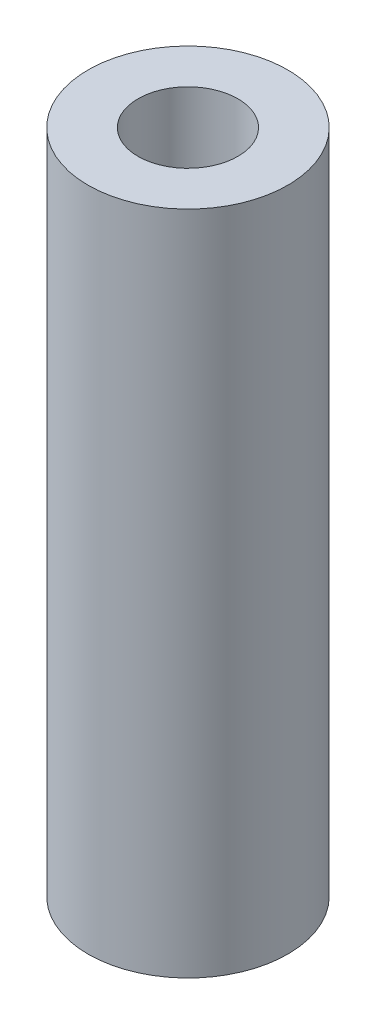
ISO-10303-21;
HEADER;
FILE_DESCRIPTION(('STEP AP214'),'2;1');
FILE_NAME('part.step','',(''),(''),'','','');
FILE_SCHEMA(('AUTOMOTIVE_DESIGN { 1 0 10303 214 1 1 1 1 }'));
ENDSEC;
DATA;
#1=APPLICATION_CONTEXT('core data for automotive mechanical design processes');
#2=APPLICATION_PROTOCOL_DEFINITION('international standard','automotive_design',2000,#1);
#3=PRODUCT_CONTEXT('',#1,'mechanical');
#4=PRODUCT('Part','Part','',(#3));
#5=PRODUCT_RELATED_PRODUCT_CATEGORY('part','',(#4));
#6=PRODUCT_DEFINITION_FORMATION('','',#4);
#7=PRODUCT_DEFINITION_CONTEXT('part definition',#1,'design');
#8=PRODUCT_DEFINITION('design','',#6,#7);
#9=PRODUCT_DEFINITION_SHAPE('','',#8);
#10=(LENGTH_UNIT() NAMED_UNIT(*) SI_UNIT(.MILLI.,.METRE.));
#11=(NAMED_UNIT(*) PLANE_ANGLE_UNIT() SI_UNIT($,.RADIAN.));
#12=(NAMED_UNIT(*) SI_UNIT($,.STERADIAN.) SOLID_ANGLE_UNIT());
#13=UNCERTAINTY_MEASURE_WITH_UNIT(LENGTH_MEASURE(1.E-05),#10,'distance_accuracy_value','');
#14=(GEOMETRIC_REPRESENTATION_CONTEXT(3) GLOBAL_UNCERTAINTY_ASSIGNED_CONTEXT((#13)) GLOBAL_UNIT_ASSIGNED_CONTEXT((#10,
#11,#12)) REPRESENTATION_CONTEXT('',''));
#15=CARTESIAN_POINT('',(0.,0.,0.));
#16=DIRECTION('',(0.,0.,1.));
#17=DIRECTION('',(1.,0.,0.));
#18=AXIS2_PLACEMENT_3D('',#15,#16,#17);
#19=CARTESIAN_POINT('',(0.,20.,0.));
#20=DIRECTION('',(0.,1.,0.));
#21=DIRECTION('',(0.,0.,1.));
#22=AXIS2_PLACEMENT_3D('',#19,#20,#21);
#23=PLANE('',#22);
#24=CARTESIAN_POINT('',(0.,20.,0.));
#25=DIRECTION('',(0.,1.,0.));
#26=DIRECTION('',(0.,0.,1.));
#27=AXIS2_PLACEMENT_3D('',#24,#25,#26);
#28=CIRCLE('',#27,3.);
#29=CARTESIAN_POINT('',(0.,20.,3.));
#30=VERTEX_POINT('',#29);
#31=EDGE_CURVE('E10',#30,#30,#28,.T.);
#32=ORIENTED_EDGE('',*,*,#31,.T.);
#33=EDGE_LOOP('',(#32));
#34=FACE_BOUND('',#33,.T.);
#35=CARTESIAN_POINT('',(0.,20.,0.));
#36=DIRECTION('',(0.,1.,0.));
#37=DIRECTION('',(0.,0.,1.));
#38=AXIS2_PLACEMENT_3D('',#35,#36,#37);
#39=CIRCLE('',#38,1.5);
#40=CARTESIAN_POINT('',(0.,20.,1.5));
#41=VERTEX_POINT('',#40);
#42=EDGE_CURVE('E44',#41,#41,#39,.T.);
#43=ORIENTED_EDGE('',*,*,#42,.F.);
#44=EDGE_LOOP('',(#43));
#45=FACE_BOUND('',#44,.T.);
#46=ADVANCED_FACE('F33',(#34,#45),#23,.T.);
#47=CARTESIAN_POINT('',(0.,0.,0.));
#48=DIRECTION('',(0.,1.,0.));
#49=DIRECTION('',(0.,0.,1.));
#50=AXIS2_PLACEMENT_3D('',#47,#48,#49);
#51=PLANE('',#50);
#52=CARTESIAN_POINT('',(0.,0.,0.));
#53=DIRECTION('',(0.,1.,0.));
#54=DIRECTION('',(0.,0.,1.));
#55=AXIS2_PLACEMENT_3D('',#52,#53,#54);
#56=CIRCLE('',#55,3.);
#57=CARTESIAN_POINT('',(0.,0.,3.));
#58=VERTEX_POINT('',#57);
#59=EDGE_CURVE('E37',#58,#58,#56,.T.);
#60=ORIENTED_EDGE('',*,*,#59,.F.);
#61=EDGE_LOOP('',(#60));
#62=FACE_BOUND('',#61,.T.);
#63=CARTESIAN_POINT('',(0.,0.,0.));
#64=DIRECTION('',(0.,1.,0.));
#65=DIRECTION('',(0.,0.,1.));
#66=AXIS2_PLACEMENT_3D('',#63,#64,#65);
#67=CIRCLE('',#66,1.5);
#68=CARTESIAN_POINT('',(0.,0.,1.5));
#69=VERTEX_POINT('',#68);
#70=EDGE_CURVE('E46',#69,#69,#67,.T.);
#71=ORIENTED_EDGE('',*,*,#70,.T.);
#72=EDGE_LOOP('',(#71));
#73=FACE_BOUND('',#72,.T.);
#74=ADVANCED_FACE('F56',(#62,#73),#51,.F.);
#75=CARTESIAN_POINT('',(0.,20.,0.));
#76=DIRECTION('',(0.,-1.,0.));
#77=DIRECTION('',(0.,0.,-1.));
#78=AXIS2_PLACEMENT_3D('',#75,#76,#77);
#79=CYLINDRICAL_SURFACE('',#78,3.);
#80=ORIENTED_EDGE('',*,*,#31,.F.);
#81=EDGE_LOOP('',(#80));
#82=FACE_BOUND('',#81,.T.);
#83=ORIENTED_EDGE('',*,*,#59,.T.);
#84=EDGE_LOOP('',(#83));
#85=FACE_BOUND('',#84,.T.);
#86=ADVANCED_FACE('F35',(#82,#85),#79,.T.);
#87=CARTESIAN_POINT('',(0.,20.,0.));
#88=DIRECTION('',(0.,-1.,0.));
#89=DIRECTION('',(0.,0.,-1.));
#90=AXIS2_PLACEMENT_3D('',#87,#88,#89);
#91=CYLINDRICAL_SURFACE('',#90,1.5);
#92=ORIENTED_EDGE('',*,*,#42,.T.);
#93=EDGE_LOOP('',(#92));
#94=FACE_BOUND('',#93,.T.);
#95=ORIENTED_EDGE('',*,*,#70,.F.);
#96=EDGE_LOOP('',(#95));
#97=FACE_BOUND('',#96,.T.);
#98=ADVANCED_FACE('F52',(#94,#97),#91,.F.);
#99=CLOSED_SHELL('',(#46,#74,#86,#98));
#100=MANIFOLD_SOLID_BREP('B2',#99);
#101=ADVANCED_BREP_SHAPE_REPRESENTATION('',(#18,#100),#14);
#102=SHAPE_DEFINITION_REPRESENTATION(#9,#101);
ENDSEC;
END-ISO-10303-21;
